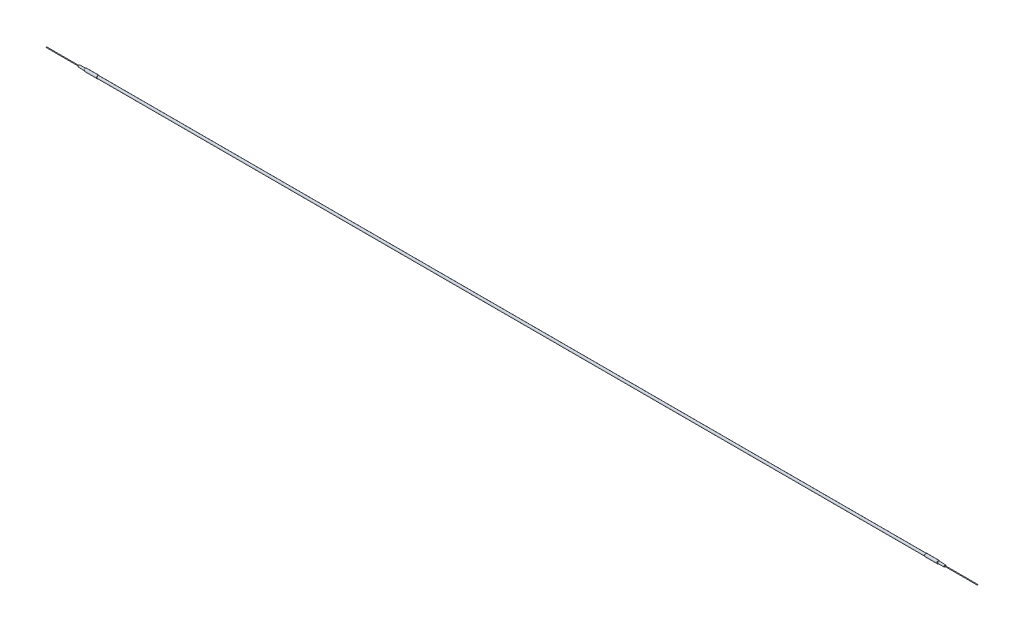
ISO-10303-21;
HEADER;
FILE_DESCRIPTION(('STEP AP214'),'2;1');
FILE_NAME('part.step','',(''),(''),'','','');
FILE_SCHEMA(('AUTOMOTIVE_DESIGN { 1 0 10303 214 1 1 1 1 }'));
ENDSEC;
DATA;
#1=APPLICATION_CONTEXT('core data for automotive mechanical design processes');
#2=APPLICATION_PROTOCOL_DEFINITION('international standard','automotive_design',2000,#1);
#3=PRODUCT_CONTEXT('',#1,'mechanical');
#4=PRODUCT('Part','Part','',(#3));
#5=PRODUCT_RELATED_PRODUCT_CATEGORY('part','',(#4));
#6=PRODUCT_DEFINITION_FORMATION('','',#4);
#7=PRODUCT_DEFINITION_CONTEXT('part definition',#1,'design');
#8=PRODUCT_DEFINITION('design','',#6,#7);
#9=PRODUCT_DEFINITION_SHAPE('','',#8);
#10=(LENGTH_UNIT() NAMED_UNIT(*) SI_UNIT(.MILLI.,.METRE.));
#11=(NAMED_UNIT(*) PLANE_ANGLE_UNIT() SI_UNIT($,.RADIAN.));
#12=(NAMED_UNIT(*) SI_UNIT($,.STERADIAN.) SOLID_ANGLE_UNIT());
#13=UNCERTAINTY_MEASURE_WITH_UNIT(LENGTH_MEASURE(1.E-05),#10,'distance_accuracy_value','');
#14=(GEOMETRIC_REPRESENTATION_CONTEXT(3) GLOBAL_UNCERTAINTY_ASSIGNED_CONTEXT((#13)) GLOBAL_UNIT_ASSIGNED_CONTEXT((#10,
#11,#12)) REPRESENTATION_CONTEXT('',''));
#15=CARTESIAN_POINT('',(0.,0.,0.));
#16=DIRECTION('',(0.,0.,1.));
#17=DIRECTION('',(1.,0.,0.));
#18=AXIS2_PLACEMENT_3D('',#15,#16,#17);
#19=CARTESIAN_POINT('',(3230.88,0.,0.));
#20=DIRECTION('',(-1.,0.,0.));
#21=DIRECTION('',(0.,0.,1.));
#22=AXIS2_PLACEMENT_3D('',#19,#20,#21);
#23=CYLINDRICAL_SURFACE('',#22,4.7625);
#24=CARTESIAN_POINT('',(3231.4134,0.,0.));
#25=DIRECTION('',(1.,0.,0.));
#26=DIRECTION('',(0.,0.,-1.));
#27=AXIS2_PLACEMENT_3D('',#24,#25,#26);
#28=CIRCLE('',#27,4.7625);
#29=CARTESIAN_POINT('',(3231.4134,0.,4.7625));
#30=VERTEX_POINT('',#29);
#31=EDGE_CURVE('E36',#30,#30,#28,.F.);
#32=CARTESIAN_POINT('',(-0.533400000000015,0.,0.));
#33=DIRECTION('',(-1.,0.,0.));
#34=DIRECTION('',(0.,0.,1.));
#35=AXIS2_PLACEMENT_3D('',#32,#33,#34);
#36=CIRCLE('',#35,4.7625);
#37=CARTESIAN_POINT('',(-0.533400000000128,0.,4.7625));
#38=VERTEX_POINT('',#37);
#39=EDGE_CURVE('E87',#38,#38,#36,.F.);
#40=CARTESIAN_POINT('',(3231.4134,0.,4.7625));
#41=CARTESIAN_POINT('',(3197.7472875,0.,4.7625));
#42=CARTESIAN_POINT('',(3164.081175,0.,4.7625));
#43=CARTESIAN_POINT('',(3096.74895,0.,4.7625));
#44=CARTESIAN_POINT('',(3063.0828375,0.,4.7625));
#45=CARTESIAN_POINT('',(2995.7506125,0.,4.7625));
#46=CARTESIAN_POINT('',(2962.0845,0.,4.7625));
#47=CARTESIAN_POINT('',(2894.752275,0.,4.7625));
#48=CARTESIAN_POINT('',(2861.0861625,0.,4.7625));
#49=CARTESIAN_POINT('',(2793.7539375,0.,4.7625));
#50=CARTESIAN_POINT('',(2760.087825,0.,4.7625));
#51=CARTESIAN_POINT('',(2692.7556,0.,4.7625));
#52=CARTESIAN_POINT('',(2659.0894875,0.,4.7625));
#53=CARTESIAN_POINT('',(2591.7572625,0.,4.7625));
#54=CARTESIAN_POINT('',(2558.09115,0.,4.7625));
#55=CARTESIAN_POINT('',(2490.758925,0.,4.7625));
#56=CARTESIAN_POINT('',(2457.0928125,0.,4.7625));
#57=CARTESIAN_POINT('',(2389.7605875,0.,4.7625));
#58=CARTESIAN_POINT('',(2356.094475,0.,4.7625));
#59=CARTESIAN_POINT('',(2288.76225,0.,4.7625));
#60=CARTESIAN_POINT('',(2255.0961375,0.,4.7625));
#61=CARTESIAN_POINT('',(2187.7639125,0.,4.7625));
#62=CARTESIAN_POINT('',(2154.0978,0.,4.7625));
#63=CARTESIAN_POINT('',(2086.765575,0.,4.7625));
#64=CARTESIAN_POINT('',(2053.0994625,0.,4.7625));
#65=CARTESIAN_POINT('',(1985.7672375,0.,4.7625));
#66=CARTESIAN_POINT('',(1952.101125,0.,4.7625));
#67=CARTESIAN_POINT('',(1884.7689,0.,4.7625));
#68=CARTESIAN_POINT('',(1851.1027875,0.,4.7625));
#69=CARTESIAN_POINT('',(1783.7705625,0.,4.7625));
#70=CARTESIAN_POINT('',(1750.10445,0.,4.7625));
#71=CARTESIAN_POINT('',(1682.772225,0.,4.7625));
#72=CARTESIAN_POINT('',(1649.1061125,0.,4.7625));
#73=CARTESIAN_POINT('',(1581.7738875,0.,4.7625));
#74=CARTESIAN_POINT('',(1548.107775,0.,4.7625));
#75=CARTESIAN_POINT('',(1480.77555,0.,4.7625));
#76=CARTESIAN_POINT('',(1447.1094375,0.,4.7625));
#77=CARTESIAN_POINT('',(1379.7772125,0.,4.7625));
#78=CARTESIAN_POINT('',(1346.1111,0.,4.7625));
#79=CARTESIAN_POINT('',(1278.778875,0.,4.7625));
#80=CARTESIAN_POINT('',(1245.1127625,0.,4.7625));
#81=CARTESIAN_POINT('',(1177.7805375,0.,4.7625));
#82=CARTESIAN_POINT('',(1144.114425,0.,4.7625));
#83=CARTESIAN_POINT('',(1076.7822,0.,4.7625));
#84=CARTESIAN_POINT('',(1043.1160875,0.,4.7625));
#85=CARTESIAN_POINT('',(975.7838625,0.,4.7625));
#86=CARTESIAN_POINT('',(942.11775,0.,4.7625));
#87=CARTESIAN_POINT('',(874.785525,0.,4.7625));
#88=CARTESIAN_POINT('',(841.1194125,0.,4.7625));
#89=CARTESIAN_POINT('',(773.7871875,0.,4.7625));
#90=CARTESIAN_POINT('',(740.121075,0.,4.7625));
#91=CARTESIAN_POINT('',(672.78885,0.,4.7625));
#92=CARTESIAN_POINT('',(639.1227375,0.,4.7625));
#93=CARTESIAN_POINT('',(571.7905125,0.,4.7625));
#94=CARTESIAN_POINT('',(538.1244,0.,4.7625));
#95=CARTESIAN_POINT('',(470.792175,0.,4.7625));
#96=CARTESIAN_POINT('',(437.1260625,0.,4.7625));
#97=CARTESIAN_POINT('',(369.7938375,0.,4.7625));
#98=CARTESIAN_POINT('',(336.127725,0.,4.7625));
#99=CARTESIAN_POINT('',(268.7955,0.,4.7625));
#100=CARTESIAN_POINT('',(235.1293875,0.,4.7625));
#101=CARTESIAN_POINT('',(167.7971625,0.,4.7625));
#102=CARTESIAN_POINT('',(134.13105,0.,4.7625));
#103=CARTESIAN_POINT('',(66.7988249999999,0.,4.7625));
#104=CARTESIAN_POINT('',(33.1327124999999,0.,4.7625));
#105=CARTESIAN_POINT('',(-0.533400000000128,0.,4.7625));
#106=B_SPLINE_CURVE_WITH_KNOTS('',3,(#40,#41,#42,#43,#44,#45,#46,#47,#48,#49,#50,#51,#52,#53,
#54,#55,#56,#57,#58,#59,#60,#61,#62,#63,#64,#65,#66,#67,#68,#69,#70,#71,#72,#73,#74,#75,#76,#77,
#78,#79,#80,#81,#82,#83,#84,#85,#86,#87,#88,#89,#90,#91,#92,#93,#94,#95,#96,#97,#98,#99,#100,
#101,#102,#103,#104,#105),.UNSPECIFIED.,.F.,.F.,(4,2,2,2,2,2,2,2,2,2,2,2,2,2,2,2,2,2,2,2,2,2,2,
2,2,2,2,2,2,2,2,2,4),(0.,100.9983375,201.996675,302.9950125,403.99335,504.9916875,605.990025,
706.9883625,807.9867,908.9850375,1009.983375,1110.9817125,1211.98005,1312.9783875,1413.976725,
1514.9750625,1615.9734,1716.9717375,1817.970075,1918.9684125,2019.96675,2120.9650875,
2221.963425,2322.9617625,2423.9601,2524.9584375,2625.956775,2726.9551125,2827.95345,
2928.9517875,3029.950125,3130.9484625,3231.9468),.UNSPECIFIED.);
#107=EDGE_CURVE('BSEAM32',#30,#38,#106,.T.);
#108=ORIENTED_EDGE('',*,*,#31,.T.);
#109=ORIENTED_EDGE('',*,*,#39,.T.);
#110=ORIENTED_EDGE('',*,*,#107,.T.);
#111=ORIENTED_EDGE('',*,*,#107,.F.);
#112=EDGE_LOOP('',(#108,#110,#109,#111));
#113=FACE_BOUND('',#112,.T.);
#114=ADVANCED_FACE('F32',(#113),#23,.T.);
#115=CARTESIAN_POINT('',(3281.68,0.,0.));
#116=DIRECTION('',(-1.,0.,0.));
#117=DIRECTION('',(0.,0.,1.));
#118=AXIS2_PLACEMENT_3D('',#115,#116,#117);
#119=CYLINDRICAL_SURFACE('',#118,5.4991);
#120=CARTESIAN_POINT('',(3280.41,0.,0.));
#121=DIRECTION('',(1.,0.,0.));
#122=DIRECTION('',(0.,0.,-1.));
#123=AXIS2_PLACEMENT_3D('',#120,#121,#122);
#124=CIRCLE('',#123,5.4991);
#125=CARTESIAN_POINT('',(3280.41,0.,-5.4991));
#126=VERTEX_POINT('',#125);
#127=EDGE_CURVE('E85',#126,#126,#124,.F.);
#128=ORIENTED_EDGE('',*,*,#127,.T.);
#129=EDGE_LOOP('',(#128));
#130=FACE_BOUND('',#129,.T.);
#131=CARTESIAN_POINT('',(3232.15,0.,0.));
#132=DIRECTION('',(1.,0.,0.));
#133=DIRECTION('',(0.,0.,-1.));
#134=AXIS2_PLACEMENT_3D('',#131,#132,#133);
#135=CIRCLE('',#134,5.4991);
#136=CARTESIAN_POINT('',(3232.15,0.,-5.4991));
#137=VERTEX_POINT('',#136);
#138=EDGE_CURVE('E82',#137,#137,#135,.T.);
#139=ORIENTED_EDGE('',*,*,#138,.T.);
#140=EDGE_LOOP('',(#139));
#141=FACE_BOUND('',#140,.T.);
#142=ADVANCED_FACE('F101',(#130,#141),#119,.T.);
#143=CARTESIAN_POINT('',(3281.68,0.,0.));
#144=DIRECTION('',(1.,0.,0.));
#145=DIRECTION('',(0.,0.,-1.));
#146=AXIS2_PLACEMENT_3D('',#143,#144,#145);
#147=PLANE('',#146);
#148=CARTESIAN_POINT('',(3281.68,0.,0.));
#149=DIRECTION('',(1.,0.,0.));
#150=DIRECTION('',(0.,0.,-1.));
#151=AXIS2_PLACEMENT_3D('',#148,#149,#150);
#152=CIRCLE('',#151,4.22909999999987);
#153=CARTESIAN_POINT('',(3281.68,0.,-4.22909999999987));
#154=VERTEX_POINT('',#153);
#155=EDGE_CURVE('E79',#154,#154,#152,.T.);
#156=ORIENTED_EDGE('',*,*,#155,.T.);
#157=EDGE_LOOP('',(#156));
#158=FACE_BOUND('',#157,.T.);
#159=CARTESIAN_POINT('',(3281.68,0.,0.));
#160=DIRECTION('',(1.,0.,0.));
#161=DIRECTION('',(0.,0.,-1.));
#162=AXIS2_PLACEMENT_3D('',#159,#160,#161);
#163=CIRCLE('',#162,3.81);
#164=CARTESIAN_POINT('',(3281.68,0.,-3.81));
#165=VERTEX_POINT('',#164);
#166=EDGE_CURVE('E53',#165,#165,#163,.T.);
#167=ORIENTED_EDGE('',*,*,#166,.F.);
#168=EDGE_LOOP('',(#167));
#169=FACE_BOUND('',#168,.T.);
#170=ADVANCED_FACE('F103',(#158,#169),#147,.T.);
#171=CARTESIAN_POINT('',(-50.8,0.,0.));
#172=DIRECTION('',(1.,0.,0.));
#173=DIRECTION('',(0.,0.,-1.));
#174=AXIS2_PLACEMENT_3D('',#171,#172,#173);
#175=CYLINDRICAL_SURFACE('',#174,5.4991);
#176=CARTESIAN_POINT('',(-1.27000000000002,0.,0.));
#177=DIRECTION('',(-1.,0.,0.));
#178=DIRECTION('',(0.,0.,1.));
#179=AXIS2_PLACEMENT_3D('',#176,#177,#178);
#180=CIRCLE('',#179,5.4991);
#181=CARTESIAN_POINT('',(-1.27000000000002,0.,5.4991));
#182=VERTEX_POINT('',#181);
#183=EDGE_CURVE('E67',#182,#182,#180,.T.);
#184=ORIENTED_EDGE('',*,*,#183,.T.);
#185=EDGE_LOOP('',(#184));
#186=FACE_BOUND('',#185,.T.);
#187=CARTESIAN_POINT('',(-49.5299999999999,0.,0.));
#188=DIRECTION('',(-1.,0.,0.));
#189=DIRECTION('',(0.,0.,1.));
#190=AXIS2_PLACEMENT_3D('',#187,#188,#189);
#191=CIRCLE('',#190,5.4991);
#192=CARTESIAN_POINT('',(-49.5299999999999,0.,5.4991));
#193=VERTEX_POINT('',#192);
#194=EDGE_CURVE('E64',#193,#193,#191,.F.);
#195=ORIENTED_EDGE('',*,*,#194,.T.);
#196=EDGE_LOOP('',(#195));
#197=FACE_BOUND('',#196,.T.);
#198=ADVANCED_FACE('F110',(#186,#197),#175,.T.);
#199=CARTESIAN_POINT('',(-50.8,0.,0.));
#200=DIRECTION('',(-1.,0.,0.));
#201=DIRECTION('',(0.,0.,1.));
#202=AXIS2_PLACEMENT_3D('',#199,#200,#201);
#203=PLANE('',#202);
#204=CARTESIAN_POINT('',(-50.8,0.,0.));
#205=DIRECTION('',(-1.,0.,0.));
#206=DIRECTION('',(0.,0.,1.));
#207=AXIS2_PLACEMENT_3D('',#204,#205,#206);
#208=CIRCLE('',#207,4.22909999999987);
#209=CARTESIAN_POINT('',(-50.8,0.,4.22909999999987));
#210=VERTEX_POINT('',#209);
#211=EDGE_CURVE('E70',#210,#210,#208,.T.);
#212=ORIENTED_EDGE('',*,*,#211,.T.);
#213=EDGE_LOOP('',(#212));
#214=FACE_BOUND('',#213,.T.);
#215=CARTESIAN_POINT('',(-50.8,0.,0.));
#216=DIRECTION('',(-1.,0.,0.));
#217=DIRECTION('',(0.,0.,1.));
#218=AXIS2_PLACEMENT_3D('',#215,#216,#217);
#219=CIRCLE('',#218,3.81);
#220=CARTESIAN_POINT('',(-50.8,0.,3.81));
#221=VERTEX_POINT('',#220);
#222=EDGE_CURVE('E51',#221,#221,#219,.T.);
#223=ORIENTED_EDGE('',*,*,#222,.F.);
#224=EDGE_LOOP('',(#223));
#225=FACE_BOUND('',#224,.T.);
#226=ADVANCED_FACE('F160',(#214,#225),#203,.T.);
#227=CARTESIAN_POINT('',(-76.2,0.,0.));
#228=DIRECTION('',(1.,0.,0.));
#229=DIRECTION('',(0.,0.,-1.));
#230=AXIS2_PLACEMENT_3D('',#227,#228,#229);
#231=CYLINDRICAL_SURFACE('',#230,3.81);
#232=CARTESIAN_POINT('',(-74.9300000000002,0.,0.));
#233=DIRECTION('',(-1.,0.,0.));
#234=DIRECTION('',(0.,0.,1.));
#235=AXIS2_PLACEMENT_3D('',#232,#233,#234);
#236=CIRCLE('',#235,3.81);
#237=CARTESIAN_POINT('',(-74.9300000000002,0.,3.81));
#238=VERTEX_POINT('',#237);
#239=EDGE_CURVE('E61',#238,#238,#236,.F.);
#240=ORIENTED_EDGE('',*,*,#239,.T.);
#241=EDGE_LOOP('',(#240));
#242=FACE_BOUND('',#241,.T.);
#243=ORIENTED_EDGE('',*,*,#222,.T.);
#244=EDGE_LOOP('',(#243));
#245=FACE_BOUND('',#244,.T.);
#246=ADVANCED_FACE('F153',(#242,#245),#231,.T.);
#247=CARTESIAN_POINT('',(-76.2,0.,0.));
#248=DIRECTION('',(-1.,0.,0.));
#249=DIRECTION('',(0.,0.,1.));
#250=AXIS2_PLACEMENT_3D('',#247,#248,#249);
#251=PLANE('',#250);
#252=CARTESIAN_POINT('',(-76.2,0.,0.));
#253=DIRECTION('',(-1.,0.,0.));
#254=DIRECTION('',(0.,0.,1.));
#255=AXIS2_PLACEMENT_3D('',#252,#253,#254);
#256=CIRCLE('',#255,1.27);
#257=CARTESIAN_POINT('',(-76.2,0.,1.27));
#258=VERTEX_POINT('',#257);
#259=EDGE_CURVE('E40',#258,#258,#256,.T.);
#260=ORIENTED_EDGE('',*,*,#259,.F.);
#261=EDGE_LOOP('',(#260));
#262=FACE_BOUND('',#261,.T.);
#263=CARTESIAN_POINT('',(-76.2,0.,0.));
#264=DIRECTION('',(-1.,0.,0.));
#265=DIRECTION('',(0.,0.,1.));
#266=AXIS2_PLACEMENT_3D('',#263,#264,#265);
#267=CIRCLE('',#266,2.54000000000021);
#268=CARTESIAN_POINT('',(-76.2,0.,2.54000000000021));
#269=VERTEX_POINT('',#268);
#270=EDGE_CURVE('E56',#269,#269,#267,.T.);
#271=ORIENTED_EDGE('',*,*,#270,.T.);
#272=EDGE_LOOP('',(#271));
#273=FACE_BOUND('',#272,.T.);
#274=ADVANCED_FACE('F144',(#262,#273),#251,.T.);
#275=CARTESIAN_POINT('',(3307.08,0.,0.));
#276=DIRECTION('',(-1.,0.,0.));
#277=DIRECTION('',(0.,0.,1.));
#278=AXIS2_PLACEMENT_3D('',#275,#276,#277);
#279=CYLINDRICAL_SURFACE('',#278,3.81);
#280=CARTESIAN_POINT('',(3305.81,0.,0.));
#281=DIRECTION('',(1.,0.,0.));
#282=DIRECTION('',(0.,0.,-1.));
#283=AXIS2_PLACEMENT_3D('',#280,#281,#282);
#284=CIRCLE('',#283,3.81);
#285=CARTESIAN_POINT('',(3305.81,0.,-3.81));
#286=VERTEX_POINT('',#285);
#287=EDGE_CURVE('E76',#286,#286,#284,.F.);
#288=ORIENTED_EDGE('',*,*,#287,.T.);
#289=EDGE_LOOP('',(#288));
#290=FACE_BOUND('',#289,.T.);
#291=ORIENTED_EDGE('',*,*,#166,.T.);
#292=EDGE_LOOP('',(#291));
#293=FACE_BOUND('',#292,.T.);
#294=ADVANCED_FACE('F142',(#290,#293),#279,.T.);
#295=CARTESIAN_POINT('',(3307.08,0.,0.));
#296=DIRECTION('',(1.,0.,0.));
#297=DIRECTION('',(0.,0.,-1.));
#298=AXIS2_PLACEMENT_3D('',#295,#296,#297);
#299=PLANE('',#298);
#300=CARTESIAN_POINT('',(3307.08,0.,0.));
#301=DIRECTION('',(1.,0.,0.));
#302=DIRECTION('',(0.,0.,-1.));
#303=AXIS2_PLACEMENT_3D('',#300,#301,#302);
#304=CIRCLE('',#303,1.27);
#305=CARTESIAN_POINT('',(3307.08,0.,-1.27));
#306=VERTEX_POINT('',#305);
#307=EDGE_CURVE('E10',#306,#306,#304,.T.);
#308=ORIENTED_EDGE('',*,*,#307,.F.);
#309=EDGE_LOOP('',(#308));
#310=FACE_BOUND('',#309,.T.);
#311=CARTESIAN_POINT('',(3307.08,0.,0.));
#312=DIRECTION('',(1.,0.,0.));
#313=DIRECTION('',(0.,0.,-1.));
#314=AXIS2_PLACEMENT_3D('',#311,#312,#313);
#315=CIRCLE('',#314,2.54000000000021);
#316=CARTESIAN_POINT('',(3307.08,0.,-2.54000000000021));
#317=VERTEX_POINT('',#316);
#318=EDGE_CURVE('E73',#317,#317,#315,.T.);
#319=ORIENTED_EDGE('',*,*,#318,.T.);
#320=EDGE_LOOP('',(#319));
#321=FACE_BOUND('',#320,.T.);
#322=ADVANCED_FACE('F120',(#310,#321),#299,.T.);
#323=CARTESIAN_POINT('',(-76.2,0.,0.));
#324=DIRECTION('',(1.,0.,0.));
#325=DIRECTION('',(0.,0.,-1.));
#326=AXIS2_PLACEMENT_3D('',#323,#324,#325);
#327=CONICAL_SURFACE('',#326,2.54000000000021,0.785398163397445);
#328=ORIENTED_EDGE('',*,*,#239,.F.);
#329=EDGE_LOOP('',(#328));
#330=FACE_BOUND('',#329,.T.);
#331=ORIENTED_EDGE('',*,*,#270,.F.);
#332=EDGE_LOOP('',(#331));
#333=FACE_BOUND('',#332,.T.);
#334=ADVANCED_FACE('F116',(#330,#333),#327,.T.);
#335=CARTESIAN_POINT('',(-1.27000000000002,0.,0.));
#336=DIRECTION('',(-1.,0.,0.));
#337=DIRECTION('',(0.,0.,1.));
#338=AXIS2_PLACEMENT_3D('',#335,#336,#337);
#339=CONICAL_SURFACE('',#338,5.4991,0.785398163397444);
#340=ORIENTED_EDGE('',*,*,#39,.F.);
#341=EDGE_LOOP('',(#340));
#342=FACE_BOUND('',#341,.T.);
#343=ORIENTED_EDGE('',*,*,#183,.F.);
#344=EDGE_LOOP('',(#343));
#345=FACE_BOUND('',#344,.T.);
#346=ADVANCED_FACE('F119',(#342,#345),#339,.T.);
#347=CARTESIAN_POINT('',(-50.8,0.,0.));
#348=DIRECTION('',(1.,0.,0.));
#349=DIRECTION('',(0.,0.,-1.));
#350=AXIS2_PLACEMENT_3D('',#347,#348,#349);
#351=CONICAL_SURFACE('',#350,4.22909999999987,0.78539816339744);
#352=ORIENTED_EDGE('',*,*,#194,.F.);
#353=EDGE_LOOP('',(#352));
#354=FACE_BOUND('',#353,.T.);
#355=ORIENTED_EDGE('',*,*,#211,.F.);
#356=EDGE_LOOP('',(#355));
#357=FACE_BOUND('',#356,.T.);
#358=ADVANCED_FACE('F124',(#354,#357),#351,.T.);
#359=CARTESIAN_POINT('',(3307.08,0.,0.));
#360=DIRECTION('',(-1.,0.,0.));
#361=DIRECTION('',(0.,0.,1.));
#362=AXIS2_PLACEMENT_3D('',#359,#360,#361);
#363=CONICAL_SURFACE('',#362,2.54000000000021,0.785398163397412);
#364=ORIENTED_EDGE('',*,*,#287,.F.);
#365=EDGE_LOOP('',(#364));
#366=FACE_BOUND('',#365,.T.);
#367=ORIENTED_EDGE('',*,*,#318,.F.);
#368=EDGE_LOOP('',(#367));
#369=FACE_BOUND('',#368,.T.);
#370=ADVANCED_FACE('F128',(#366,#369),#363,.T.);
#371=CARTESIAN_POINT('',(3281.68,0.,0.));
#372=DIRECTION('',(-1.,0.,0.));
#373=DIRECTION('',(0.,0.,1.));
#374=AXIS2_PLACEMENT_3D('',#371,#372,#373);
#375=CONICAL_SURFACE('',#374,4.22909999999987,0.785398163397194);
#376=ORIENTED_EDGE('',*,*,#127,.F.);
#377=EDGE_LOOP('',(#376));
#378=FACE_BOUND('',#377,.T.);
#379=ORIENTED_EDGE('',*,*,#155,.F.);
#380=EDGE_LOOP('',(#379));
#381=FACE_BOUND('',#380,.T.);
#382=ADVANCED_FACE('F98',(#378,#381),#375,.T.);
#383=CARTESIAN_POINT('',(3232.15,0.,0.));
#384=DIRECTION('',(1.,0.,0.));
#385=DIRECTION('',(0.,0.,-1.));
#386=AXIS2_PLACEMENT_3D('',#383,#384,#385);
#387=CONICAL_SURFACE('',#386,5.4991,0.785398163397498);
#388=ORIENTED_EDGE('',*,*,#31,.F.);
#389=EDGE_LOOP('',(#388));
#390=FACE_BOUND('',#389,.T.);
#391=ORIENTED_EDGE('',*,*,#138,.F.);
#392=EDGE_LOOP('',(#391));
#393=FACE_BOUND('',#392,.T.);
#394=ADVANCED_FACE('F34',(#390,#393),#387,.T.);
#395=CARTESIAN_POINT('',(-203.2,0.,0.));
#396=DIRECTION('',(1.,0.,0.));
#397=DIRECTION('',(0.,0.,-1.));
#398=AXIS2_PLACEMENT_3D('',#395,#396,#397);
#399=CYLINDRICAL_SURFACE('',#398,1.27);
#400=CARTESIAN_POINT('',(-203.2,0.,0.));
#401=DIRECTION('',(-1.,0.,0.));
#402=DIRECTION('',(0.,0.,1.));
#403=AXIS2_PLACEMENT_3D('',#400,#401,#402);
#404=CIRCLE('',#403,1.27);
#405=CARTESIAN_POINT('',(-203.2,0.,1.27));
#406=VERTEX_POINT('',#405);
#407=EDGE_CURVE('E49',#406,#406,#404,.T.);
#408=ORIENTED_EDGE('',*,*,#407,.F.);
#409=EDGE_LOOP('',(#408));
#410=FACE_BOUND('',#409,.T.);
#411=ORIENTED_EDGE('',*,*,#259,.T.);
#412=EDGE_LOOP('',(#411));
#413=FACE_BOUND('',#412,.T.);
#414=ADVANCED_FACE('F97',(#410,#413),#399,.T.);
#415=CARTESIAN_POINT('',(-203.2,0.,0.));
#416=DIRECTION('',(-1.,0.,0.));
#417=DIRECTION('',(0.,0.,1.));
#418=AXIS2_PLACEMENT_3D('',#415,#416,#417);
#419=PLANE('',#418);
#420=ORIENTED_EDGE('',*,*,#407,.T.);
#421=EDGE_LOOP('',(#420));
#422=FACE_BOUND('',#421,.T.);
#423=ADVANCED_FACE('F204',(#422),#419,.T.);
#424=CARTESIAN_POINT('',(3434.08,0.,0.));
#425=DIRECTION('',(-1.,0.,0.));
#426=DIRECTION('',(0.,0.,1.));
#427=AXIS2_PLACEMENT_3D('',#424,#425,#426);
#428=CYLINDRICAL_SURFACE('',#427,1.27);
#429=CARTESIAN_POINT('',(3434.08,0.,0.));
#430=DIRECTION('',(1.,0.,0.));
#431=DIRECTION('',(0.,0.,-1.));
#432=AXIS2_PLACEMENT_3D('',#429,#430,#431);
#433=CIRCLE('',#432,1.27);
#434=CARTESIAN_POINT('',(3434.08,0.,-1.27));
#435=VERTEX_POINT('',#434);
#436=EDGE_CURVE('E48',#435,#435,#433,.T.);
#437=ORIENTED_EDGE('',*,*,#436,.F.);
#438=EDGE_LOOP('',(#437));
#439=FACE_BOUND('',#438,.T.);
#440=ORIENTED_EDGE('',*,*,#307,.T.);
#441=EDGE_LOOP('',(#440));
#442=FACE_BOUND('',#441,.T.);
#443=ADVANCED_FACE('F213',(#439,#442),#428,.T.);
#444=CARTESIAN_POINT('',(3434.08,0.,0.));
#445=DIRECTION('',(1.,0.,0.));
#446=DIRECTION('',(0.,0.,-1.));
#447=AXIS2_PLACEMENT_3D('',#444,#445,#446);
#448=PLANE('',#447);
#449=ORIENTED_EDGE('',*,*,#436,.T.);
#450=EDGE_LOOP('',(#449));
#451=FACE_BOUND('',#450,.T.);
#452=ADVANCED_FACE('F230',(#451),#448,.T.);
#453=CLOSED_SHELL('',(#114,#142,#170,#198,#226,#246,#274,#294,#322,#334,#346,#358,#370,#382,
#394,#414,#423,#443,#452));
#454=MANIFOLD_SOLID_BREP('B2',#453);
#455=ADVANCED_BREP_SHAPE_REPRESENTATION('',(#18,#454),#14);
#456=SHAPE_DEFINITION_REPRESENTATION(#9,#455);
ENDSEC;
END-ISO-10303-21;
